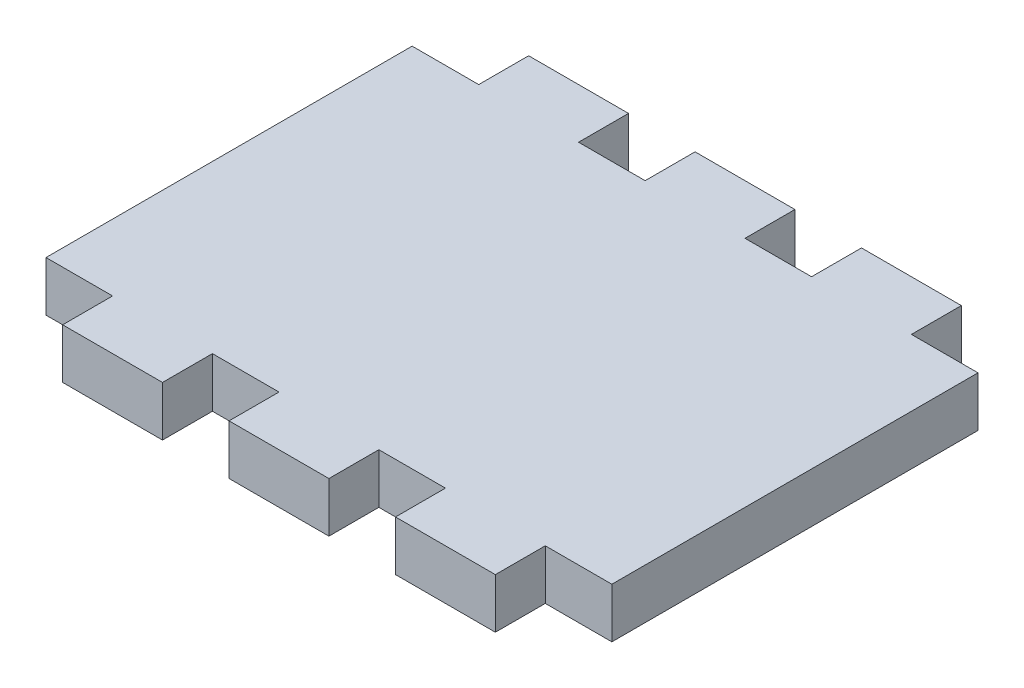
ISO-10303-21;
HEADER;
FILE_DESCRIPTION(('STEP AP214'),'2;1');
FILE_NAME('part.step','',(''),(''),'','','');
FILE_SCHEMA(('AUTOMOTIVE_DESIGN { 1 0 10303 214 1 1 1 1 }'));
ENDSEC;
DATA;
#1=APPLICATION_CONTEXT('core data for automotive mechanical design processes');
#2=APPLICATION_PROTOCOL_DEFINITION('international standard','automotive_design',2000,#1);
#3=PRODUCT_CONTEXT('',#1,'mechanical');
#4=PRODUCT('Part','Part','',(#3));
#5=PRODUCT_RELATED_PRODUCT_CATEGORY('part','',(#4));
#6=PRODUCT_DEFINITION_FORMATION('','',#4);
#7=PRODUCT_DEFINITION_CONTEXT('part definition',#1,'design');
#8=PRODUCT_DEFINITION('design','',#6,#7);
#9=PRODUCT_DEFINITION_SHAPE('','',#8);
#10=(LENGTH_UNIT() NAMED_UNIT(*) SI_UNIT(.MILLI.,.METRE.));
#11=(NAMED_UNIT(*) PLANE_ANGLE_UNIT() SI_UNIT($,.RADIAN.));
#12=(NAMED_UNIT(*) SI_UNIT($,.STERADIAN.) SOLID_ANGLE_UNIT());
#13=UNCERTAINTY_MEASURE_WITH_UNIT(LENGTH_MEASURE(1.E-05),#10,'distance_accuracy_value','');
#14=(GEOMETRIC_REPRESENTATION_CONTEXT(3) GLOBAL_UNCERTAINTY_ASSIGNED_CONTEXT((#13)) GLOBAL_UNIT_ASSIGNED_CONTEXT((#10,
#11,#12)) REPRESENTATION_CONTEXT('',''));
#15=CARTESIAN_POINT('',(0.,0.,0.));
#16=DIRECTION('',(0.,0.,1.));
#17=DIRECTION('',(1.,0.,0.));
#18=AXIS2_PLACEMENT_3D('',#15,#16,#17);
#19=CARTESIAN_POINT('',(-17.,3.,14.));
#20=DIRECTION('',(0.,0.,-1.));
#21=DIRECTION('',(-1.,0.,0.));
#22=AXIS2_PLACEMENT_3D('',#19,#20,#21);
#23=PLANE('',#22);
#24=DIRECTION('',(1.,0.,0.));
#25=VECTOR('',#24,1.);
#26=CARTESIAN_POINT('',(-17.,0.,14.));
#27=LINE('',#26,#25);
#28=CARTESIAN_POINT('',(-3.,0.,14.));
#29=VERTEX_POINT('',#28);
#30=CARTESIAN_POINT('',(3.,0.,14.));
#31=VERTEX_POINT('',#30);
#32=EDGE_CURVE('E243',#29,#31,#27,.T.);
#33=ORIENTED_EDGE('',*,*,#32,.T.);
#34=DIRECTION('',(0.,1.,0.));
#35=VECTOR('',#34,1.);
#36=CARTESIAN_POINT('',(3.,0.,14.));
#37=LINE('',#36,#35);
#38=CARTESIAN_POINT('',(3.,3.,14.));
#39=VERTEX_POINT('',#38);
#40=EDGE_CURVE('E439',#31,#39,#37,.T.);
#41=ORIENTED_EDGE('',*,*,#40,.T.);
#42=DIRECTION('',(1.,0.,0.));
#43=VECTOR('',#42,1.);
#44=CARTESIAN_POINT('',(-17.,3.,14.));
#45=LINE('',#44,#43);
#46=CARTESIAN_POINT('',(-3.,3.,14.));
#47=VERTEX_POINT('',#46);
#48=EDGE_CURVE('E42',#47,#39,#45,.T.);
#49=ORIENTED_EDGE('',*,*,#48,.F.);
#50=DIRECTION('',(0.,1.,0.));
#51=VECTOR('',#50,1.);
#52=CARTESIAN_POINT('',(-3.,0.,14.));
#53=LINE('',#52,#51);
#54=EDGE_CURVE('E372',#29,#47,#53,.T.);
#55=ORIENTED_EDGE('',*,*,#54,.F.);
#56=EDGE_LOOP('',(#33,#41,#49,#55));
#57=FACE_BOUND('',#56,.T.);
#58=ADVANCED_FACE('F33',(#57),#23,.F.);
#59=CARTESIAN_POINT('',(-17.,3.,-14.));
#60=DIRECTION('',(0.,0.,1.));
#61=DIRECTION('',(1.,0.,0.));
#62=AXIS2_PLACEMENT_3D('',#59,#60,#61);
#63=PLANE('',#62);
#64=DIRECTION('',(-1.,0.,0.));
#65=VECTOR('',#64,1.);
#66=CARTESIAN_POINT('',(-17.,3.,-14.));
#67=LINE('',#66,#65);
#68=CARTESIAN_POINT('',(3.,3.,-14.));
#69=VERTEX_POINT('',#68);
#70=CARTESIAN_POINT('',(-3.,3.,-14.));
#71=VERTEX_POINT('',#70);
#72=EDGE_CURVE('E261',#69,#71,#67,.T.);
#73=ORIENTED_EDGE('',*,*,#72,.F.);
#74=DIRECTION('',(0.,1.,0.));
#75=VECTOR('',#74,1.);
#76=CARTESIAN_POINT('',(3.,0.,-14.));
#77=LINE('',#76,#75);
#78=CARTESIAN_POINT('',(3.,0.,-14.));
#79=VERTEX_POINT('',#78);
#80=EDGE_CURVE('E398',#79,#69,#77,.T.);
#81=ORIENTED_EDGE('',*,*,#80,.F.);
#82=DIRECTION('',(-1.,0.,0.));
#83=VECTOR('',#82,1.);
#84=CARTESIAN_POINT('',(-17.,0.,-14.));
#85=LINE('',#84,#83);
#86=CARTESIAN_POINT('',(-3.,0.,-14.));
#87=VERTEX_POINT('',#86);
#88=EDGE_CURVE('E274',#79,#87,#85,.T.);
#89=ORIENTED_EDGE('',*,*,#88,.T.);
#90=DIRECTION('',(0.,1.,0.));
#91=VECTOR('',#90,1.);
#92=CARTESIAN_POINT('',(-3.,0.,-14.));
#93=LINE('',#92,#91);
#94=EDGE_CURVE('E339',#87,#71,#93,.T.);
#95=ORIENTED_EDGE('',*,*,#94,.T.);
#96=EDGE_LOOP('',(#73,#81,#89,#95));
#97=FACE_BOUND('',#96,.T.);
#98=ADVANCED_FACE('F396',(#97),#63,.F.);
#99=CARTESIAN_POINT('',(-13.,0.,14.));
#100=VERTEX_POINT('',#99);
#101=CARTESIAN_POINT('',(-7.,0.,14.));
#102=VERTEX_POINT('',#101);
#103=EDGE_CURVE('E37',#100,#102,#27,.T.);
#104=ORIENTED_EDGE('',*,*,#103,.T.);
#105=DIRECTION('',(0.,1.,0.));
#106=VECTOR('',#105,1.);
#107=CARTESIAN_POINT('',(-7.,0.,14.));
#108=LINE('',#107,#106);
#109=CARTESIAN_POINT('',(-7.,3.,14.));
#110=VERTEX_POINT('',#109);
#111=EDGE_CURVE('E368',#102,#110,#108,.T.);
#112=ORIENTED_EDGE('',*,*,#111,.T.);
#113=CARTESIAN_POINT('',(-13.,3.,14.));
#114=VERTEX_POINT('',#113);
#115=EDGE_CURVE('E11',#114,#110,#45,.T.);
#116=ORIENTED_EDGE('',*,*,#115,.F.);
#117=DIRECTION('',(0.,1.,0.));
#118=VECTOR('',#117,1.);
#119=CARTESIAN_POINT('',(-13.,0.,14.));
#120=LINE('',#119,#118);
#121=EDGE_CURVE('E353',#100,#114,#120,.T.);
#122=ORIENTED_EDGE('',*,*,#121,.F.);
#123=EDGE_LOOP('',(#104,#112,#116,#122));
#124=FACE_BOUND('',#123,.T.);
#125=ADVANCED_FACE('F367',(#124),#23,.F.);
#126=CARTESIAN_POINT('',(-7.,3.,-14.));
#127=VERTEX_POINT('',#126);
#128=CARTESIAN_POINT('',(-13.,3.,-14.));
#129=VERTEX_POINT('',#128);
#130=EDGE_CURVE('E254',#127,#129,#67,.T.);
#131=ORIENTED_EDGE('',*,*,#130,.F.);
#132=DIRECTION('',(0.,1.,0.));
#133=VECTOR('',#132,1.);
#134=CARTESIAN_POINT('',(-7.,0.,-14.));
#135=LINE('',#134,#133);
#136=CARTESIAN_POINT('',(-7.,0.,-14.));
#137=VERTEX_POINT('',#136);
#138=EDGE_CURVE('E287',#137,#127,#135,.T.);
#139=ORIENTED_EDGE('',*,*,#138,.F.);
#140=CARTESIAN_POINT('',(-13.,0.,-14.));
#141=VERTEX_POINT('',#140);
#142=EDGE_CURVE('E272',#137,#141,#85,.T.);
#143=ORIENTED_EDGE('',*,*,#142,.T.);
#144=DIRECTION('',(0.,1.,0.));
#145=VECTOR('',#144,1.);
#146=CARTESIAN_POINT('',(-13.,0.,-14.));
#147=LINE('',#146,#145);
#148=EDGE_CURVE('E273',#141,#129,#147,.T.);
#149=ORIENTED_EDGE('',*,*,#148,.T.);
#150=EDGE_LOOP('',(#131,#139,#143,#149));
#151=FACE_BOUND('',#150,.T.);
#152=ADVANCED_FACE('F286',(#151),#63,.F.);
#153=CARTESIAN_POINT('',(17.,3.,14.));
#154=DIRECTION('',(-1.,0.,0.));
#155=DIRECTION('',(0.,0.,1.));
#156=AXIS2_PLACEMENT_3D('',#153,#154,#155);
#157=PLANE('',#156);
#158=DIRECTION('',(0.,0.,-1.));
#159=VECTOR('',#158,1.);
#160=CARTESIAN_POINT('',(17.,3.,14.));
#161=LINE('',#160,#159);
#162=CARTESIAN_POINT('',(17.,3.,11.));
#163=VERTEX_POINT('',#162);
#164=CARTESIAN_POINT('',(17.,3.,-11.));
#165=VERTEX_POINT('',#164);
#166=EDGE_CURVE('E249',#163,#165,#161,.T.);
#167=ORIENTED_EDGE('',*,*,#166,.F.);
#168=DIRECTION('',(0.,1.,0.));
#169=VECTOR('',#168,1.);
#170=CARTESIAN_POINT('',(17.,0.,11.));
#171=LINE('',#170,#169);
#172=CARTESIAN_POINT('',(17.,0.,11.));
#173=VERTEX_POINT('',#172);
#174=EDGE_CURVE('E229',#173,#163,#171,.T.);
#175=ORIENTED_EDGE('',*,*,#174,.F.);
#176=DIRECTION('',(0.,0.,-1.));
#177=VECTOR('',#176,1.);
#178=CARTESIAN_POINT('',(17.,0.,14.));
#179=LINE('',#178,#177);
#180=CARTESIAN_POINT('',(17.,0.,-11.));
#181=VERTEX_POINT('',#180);
#182=EDGE_CURVE('E59',#173,#181,#179,.T.);
#183=ORIENTED_EDGE('',*,*,#182,.T.);
#184=DIRECTION('',(0.,1.,0.));
#185=VECTOR('',#184,1.);
#186=CARTESIAN_POINT('',(17.,0.,-11.));
#187=LINE('',#186,#185);
#188=EDGE_CURVE('E498',#181,#165,#187,.T.);
#189=ORIENTED_EDGE('',*,*,#188,.T.);
#190=EDGE_LOOP('',(#167,#175,#183,#189));
#191=FACE_BOUND('',#190,.T.);
#192=ADVANCED_FACE('F35',(#191),#157,.F.);
#193=CARTESIAN_POINT('',(13.,3.,-14.));
#194=VERTEX_POINT('',#193);
#195=CARTESIAN_POINT('',(7.,3.,-14.));
#196=VERTEX_POINT('',#195);
#197=EDGE_CURVE('E263',#194,#196,#67,.T.);
#198=ORIENTED_EDGE('',*,*,#197,.F.);
#199=DIRECTION('',(0.,1.,0.));
#200=VECTOR('',#199,1.);
#201=CARTESIAN_POINT('',(13.,0.,-14.));
#202=LINE('',#201,#200);
#203=CARTESIAN_POINT('',(13.,0.,-14.));
#204=VERTEX_POINT('',#203);
#205=EDGE_CURVE('E453',#204,#194,#202,.T.);
#206=ORIENTED_EDGE('',*,*,#205,.F.);
#207=CARTESIAN_POINT('',(7.,0.,-14.));
#208=VERTEX_POINT('',#207);
#209=EDGE_CURVE('E247',#204,#208,#85,.T.);
#210=ORIENTED_EDGE('',*,*,#209,.T.);
#211=DIRECTION('',(0.,1.,0.));
#212=VECTOR('',#211,1.);
#213=CARTESIAN_POINT('',(7.,0.,-14.));
#214=LINE('',#213,#212);
#215=EDGE_CURVE('E402',#208,#196,#214,.T.);
#216=ORIENTED_EDGE('',*,*,#215,.T.);
#217=EDGE_LOOP('',(#198,#206,#210,#216));
#218=FACE_BOUND('',#217,.T.);
#219=ADVANCED_FACE('F482',(#218),#63,.F.);
#220=CARTESIAN_POINT('',(-17.,3.,14.));
#221=DIRECTION('',(1.,0.,0.));
#222=DIRECTION('',(0.,0.,-1.));
#223=AXIS2_PLACEMENT_3D('',#220,#221,#222);
#224=PLANE('',#223);
#225=DIRECTION('',(0.,0.,1.));
#226=VECTOR('',#225,1.);
#227=CARTESIAN_POINT('',(-17.,0.,14.));
#228=LINE('',#227,#226);
#229=CARTESIAN_POINT('',(-17.,0.,-11.));
#230=VERTEX_POINT('',#229);
#231=CARTESIAN_POINT('',(-17.,0.,11.));
#232=VERTEX_POINT('',#231);
#233=EDGE_CURVE('E244',#230,#232,#228,.T.);
#234=ORIENTED_EDGE('',*,*,#233,.T.);
#235=DIRECTION('',(0.,1.,0.));
#236=VECTOR('',#235,1.);
#237=CARTESIAN_POINT('',(-17.,0.,11.));
#238=LINE('',#237,#236);
#239=CARTESIAN_POINT('',(-17.,3.,11.));
#240=VERTEX_POINT('',#239);
#241=EDGE_CURVE('E309',#232,#240,#238,.T.);
#242=ORIENTED_EDGE('',*,*,#241,.T.);
#243=DIRECTION('',(0.,0.,1.));
#244=VECTOR('',#243,1.);
#245=CARTESIAN_POINT('',(-17.,3.,14.));
#246=LINE('',#245,#244);
#247=CARTESIAN_POINT('',(-17.,3.,-11.));
#248=VERTEX_POINT('',#247);
#249=EDGE_CURVE('E268',#248,#240,#246,.T.);
#250=ORIENTED_EDGE('',*,*,#249,.F.);
#251=DIRECTION('',(0.,1.,0.));
#252=VECTOR('',#251,1.);
#253=CARTESIAN_POINT('',(-17.,0.,-11.));
#254=LINE('',#253,#252);
#255=EDGE_CURVE('E265',#230,#248,#254,.T.);
#256=ORIENTED_EDGE('',*,*,#255,.F.);
#257=EDGE_LOOP('',(#234,#242,#250,#256));
#258=FACE_BOUND('',#257,.T.);
#259=ADVANCED_FACE('F530',(#258),#224,.F.);
#260=CARTESIAN_POINT('',(7.,0.,14.));
#261=VERTEX_POINT('',#260);
#262=CARTESIAN_POINT('',(13.,0.,14.));
#263=VERTEX_POINT('',#262);
#264=EDGE_CURVE('E237',#261,#263,#27,.T.);
#265=ORIENTED_EDGE('',*,*,#264,.T.);
#266=DIRECTION('',(0.,1.,0.));
#267=VECTOR('',#266,1.);
#268=CARTESIAN_POINT('',(13.,0.,14.));
#269=LINE('',#268,#267);
#270=CARTESIAN_POINT('',(13.,3.,14.));
#271=VERTEX_POINT('',#270);
#272=EDGE_CURVE('E221',#263,#271,#269,.T.);
#273=ORIENTED_EDGE('',*,*,#272,.T.);
#274=CARTESIAN_POINT('',(7.,3.,14.));
#275=VERTEX_POINT('',#274);
#276=EDGE_CURVE('E44',#275,#271,#45,.T.);
#277=ORIENTED_EDGE('',*,*,#276,.F.);
#278=DIRECTION('',(0.,1.,0.));
#279=VECTOR('',#278,1.);
#280=CARTESIAN_POINT('',(7.,0.,14.));
#281=LINE('',#280,#279);
#282=EDGE_CURVE('E242',#261,#275,#281,.T.);
#283=ORIENTED_EDGE('',*,*,#282,.F.);
#284=EDGE_LOOP('',(#265,#273,#277,#283));
#285=FACE_BOUND('',#284,.T.);
#286=ADVANCED_FACE('F241',(#285),#23,.F.);
#287=CARTESIAN_POINT('',(0.,3.,0.));
#288=DIRECTION('',(0.,-1.,0.));
#289=DIRECTION('',(0.,0.,-1.));
#290=AXIS2_PLACEMENT_3D('',#287,#288,#289);
#291=PLANE('',#290);
#292=ORIENTED_EDGE('',*,*,#276,.T.);
#293=DIRECTION('',(0.,0.,1.));
#294=VECTOR('',#293,1.);
#295=CARTESIAN_POINT('',(13.,3.,11.));
#296=LINE('',#295,#294);
#297=CARTESIAN_POINT('',(13.,3.,11.));
#298=VERTEX_POINT('',#297);
#299=EDGE_CURVE('E224',#298,#271,#296,.T.);
#300=ORIENTED_EDGE('',*,*,#299,.F.);
#301=DIRECTION('',(-1.,0.,0.));
#302=VECTOR('',#301,1.);
#303=CARTESIAN_POINT('',(13.,3.,11.));
#304=LINE('',#303,#302);
#305=EDGE_CURVE('E238',#163,#298,#304,.T.);
#306=ORIENTED_EDGE('',*,*,#305,.F.);
#307=ORIENTED_EDGE('',*,*,#166,.T.);
#308=DIRECTION('',(1.,0.,0.));
#309=VECTOR('',#308,1.);
#310=CARTESIAN_POINT('',(13.,3.,-11.));
#311=LINE('',#310,#309);
#312=CARTESIAN_POINT('',(13.,3.,-11.));
#313=VERTEX_POINT('',#312);
#314=EDGE_CURVE('E486',#313,#165,#311,.T.);
#315=ORIENTED_EDGE('',*,*,#314,.F.);
#316=DIRECTION('',(0.,0.,1.));
#317=VECTOR('',#316,1.);
#318=CARTESIAN_POINT('',(13.,3.,-14.));
#319=LINE('',#318,#317);
#320=EDGE_CURVE('E485',#194,#313,#319,.T.);
#321=ORIENTED_EDGE('',*,*,#320,.F.);
#322=ORIENTED_EDGE('',*,*,#197,.T.);
#323=DIRECTION('',(0.,0.,-1.));
#324=VECTOR('',#323,1.);
#325=CARTESIAN_POINT('',(7.,3.,-14.));
#326=LINE('',#325,#324);
#327=CARTESIAN_POINT('',(7.,3.,-11.));
#328=VERTEX_POINT('',#327);
#329=EDGE_CURVE('E409',#328,#196,#326,.T.);
#330=ORIENTED_EDGE('',*,*,#329,.F.);
#331=DIRECTION('',(1.,0.,0.));
#332=VECTOR('',#331,1.);
#333=CARTESIAN_POINT('',(3.,3.,-11.));
#334=LINE('',#333,#332);
#335=CARTESIAN_POINT('',(3.,3.,-11.));
#336=VERTEX_POINT('',#335);
#337=EDGE_CURVE('E472',#336,#328,#334,.T.);
#338=ORIENTED_EDGE('',*,*,#337,.F.);
#339=DIRECTION('',(0.,0.,1.));
#340=VECTOR('',#339,1.);
#341=CARTESIAN_POINT('',(3.,3.,-14.));
#342=LINE('',#341,#340);
#343=EDGE_CURVE('E459',#69,#336,#342,.T.);
#344=ORIENTED_EDGE('',*,*,#343,.F.);
#345=ORIENTED_EDGE('',*,*,#72,.T.);
#346=DIRECTION('',(0.,0.,-1.));
#347=VECTOR('',#346,1.);
#348=CARTESIAN_POINT('',(-3.,3.,-14.));
#349=LINE('',#348,#347);
#350=CARTESIAN_POINT('',(-3.,3.,-11.));
#351=VERTEX_POINT('',#350);
#352=EDGE_CURVE('E326',#351,#71,#349,.T.);
#353=ORIENTED_EDGE('',*,*,#352,.F.);
#354=DIRECTION('',(1.,0.,0.));
#355=VECTOR('',#354,1.);
#356=CARTESIAN_POINT('',(-7.,3.,-11.));
#357=LINE('',#356,#355);
#358=CARTESIAN_POINT('',(-7.,3.,-11.));
#359=VERTEX_POINT('',#358);
#360=EDGE_CURVE('E322',#359,#351,#357,.T.);
#361=ORIENTED_EDGE('',*,*,#360,.F.);
#362=DIRECTION('',(0.,0.,1.));
#363=VECTOR('',#362,1.);
#364=CARTESIAN_POINT('',(-7.,3.,-14.));
#365=LINE('',#364,#363);
#366=EDGE_CURVE('E319',#127,#359,#365,.T.);
#367=ORIENTED_EDGE('',*,*,#366,.F.);
#368=ORIENTED_EDGE('',*,*,#130,.T.);
#369=DIRECTION('',(0.,0.,-1.));
#370=VECTOR('',#369,1.);
#371=CARTESIAN_POINT('',(-13.,3.,-14.));
#372=LINE('',#371,#370);
#373=CARTESIAN_POINT('',(-13.,3.,-11.));
#374=VERTEX_POINT('',#373);
#375=EDGE_CURVE('E296',#374,#129,#372,.T.);
#376=ORIENTED_EDGE('',*,*,#375,.F.);
#377=DIRECTION('',(1.,0.,0.));
#378=VECTOR('',#377,1.);
#379=CARTESIAN_POINT('',(-17.,3.,-11.));
#380=LINE('',#379,#378);
#381=EDGE_CURVE('E306',#248,#374,#380,.T.);
#382=ORIENTED_EDGE('',*,*,#381,.F.);
#383=ORIENTED_EDGE('',*,*,#249,.T.);
#384=DIRECTION('',(-1.,0.,0.));
#385=VECTOR('',#384,1.);
#386=CARTESIAN_POINT('',(-17.,3.,11.));
#387=LINE('',#386,#385);
#388=CARTESIAN_POINT('',(-13.,3.,11.));
#389=VERTEX_POINT('',#388);
#390=EDGE_CURVE('E350',#389,#240,#387,.T.);
#391=ORIENTED_EDGE('',*,*,#390,.F.);
#392=DIRECTION('',(0.,0.,-1.));
#393=VECTOR('',#392,1.);
#394=CARTESIAN_POINT('',(-13.,3.,11.));
#395=LINE('',#394,#393);
#396=EDGE_CURVE('E338',#114,#389,#395,.T.);
#397=ORIENTED_EDGE('',*,*,#396,.F.);
#398=ORIENTED_EDGE('',*,*,#115,.T.);
#399=DIRECTION('',(0.,0.,1.));
#400=VECTOR('',#399,1.);
#401=CARTESIAN_POINT('',(-7.,3.,11.));
#402=LINE('',#401,#400);
#403=CARTESIAN_POINT('',(-7.,3.,11.));
#404=VERTEX_POINT('',#403);
#405=EDGE_CURVE('E401',#404,#110,#402,.T.);
#406=ORIENTED_EDGE('',*,*,#405,.F.);
#407=DIRECTION('',(-1.,0.,0.));
#408=VECTOR('',#407,1.);
#409=CARTESIAN_POINT('',(-7.,3.,11.));
#410=LINE('',#409,#408);
#411=CARTESIAN_POINT('',(-3.,3.,11.));
#412=VERTEX_POINT('',#411);
#413=EDGE_CURVE('E418',#412,#404,#410,.T.);
#414=ORIENTED_EDGE('',*,*,#413,.F.);
#415=DIRECTION('',(0.,0.,-1.));
#416=VECTOR('',#415,1.);
#417=CARTESIAN_POINT('',(-3.,3.,11.));
#418=LINE('',#417,#416);
#419=EDGE_CURVE('E404',#47,#412,#418,.T.);
#420=ORIENTED_EDGE('',*,*,#419,.F.);
#421=ORIENTED_EDGE('',*,*,#48,.T.);
#422=DIRECTION('',(0.,0.,1.));
#423=VECTOR('',#422,1.);
#424=CARTESIAN_POINT('',(3.,3.,11.));
#425=LINE('',#424,#423);
#426=CARTESIAN_POINT('',(3.,3.,11.));
#427=VERTEX_POINT('',#426);
#428=EDGE_CURVE('E449',#427,#39,#425,.T.);
#429=ORIENTED_EDGE('',*,*,#428,.F.);
#430=DIRECTION('',(-1.,0.,0.));
#431=VECTOR('',#430,1.);
#432=CARTESIAN_POINT('',(3.,3.,11.));
#433=LINE('',#432,#431);
#434=CARTESIAN_POINT('',(7.,3.,11.));
#435=VERTEX_POINT('',#434);
#436=EDGE_CURVE('E446',#435,#427,#433,.T.);
#437=ORIENTED_EDGE('',*,*,#436,.F.);
#438=DIRECTION('',(0.,0.,-1.));
#439=VECTOR('',#438,1.);
#440=CARTESIAN_POINT('',(7.,3.,11.));
#441=LINE('',#440,#439);
#442=EDGE_CURVE('E444',#275,#435,#441,.T.);
#443=ORIENTED_EDGE('',*,*,#442,.F.);
#444=EDGE_LOOP('',(#292,#300,#306,#307,#315,#321,#322,#330,#338,#344,#345,#353,#361,#367,#368,
#376,#382,#383,#391,#397,#398,#406,#414,#420,#421,#429,#437,#443));
#445=FACE_BOUND('',#444,.T.);
#446=ADVANCED_FACE('F315',(#445),#291,.F.);
#447=CARTESIAN_POINT('',(0.,0.,0.));
#448=DIRECTION('',(0.,-1.,0.));
#449=DIRECTION('',(0.,0.,-1.));
#450=AXIS2_PLACEMENT_3D('',#447,#448,#449);
#451=PLANE('',#450);
#452=DIRECTION('',(0.,0.,1.));
#453=VECTOR('',#452,1.);
#454=CARTESIAN_POINT('',(13.,0.,11.));
#455=LINE('',#454,#453);
#456=CARTESIAN_POINT('',(13.,0.,11.));
#457=VERTEX_POINT('',#456);
#458=EDGE_CURVE('E51',#457,#263,#455,.T.);
#459=ORIENTED_EDGE('',*,*,#458,.T.);
#460=ORIENTED_EDGE('',*,*,#264,.F.);
#461=DIRECTION('',(0.,0.,-1.));
#462=VECTOR('',#461,1.);
#463=CARTESIAN_POINT('',(7.,0.,11.));
#464=LINE('',#463,#462);
#465=CARTESIAN_POINT('',(7.,0.,11.));
#466=VERTEX_POINT('',#465);
#467=EDGE_CURVE('E503',#261,#466,#464,.T.);
#468=ORIENTED_EDGE('',*,*,#467,.T.);
#469=DIRECTION('',(-1.,0.,0.));
#470=VECTOR('',#469,1.);
#471=CARTESIAN_POINT('',(3.,0.,11.));
#472=LINE('',#471,#470);
#473=CARTESIAN_POINT('',(3.,0.,11.));
#474=VERTEX_POINT('',#473);
#475=EDGE_CURVE('E464',#466,#474,#472,.T.);
#476=ORIENTED_EDGE('',*,*,#475,.T.);
#477=DIRECTION('',(0.,0.,1.));
#478=VECTOR('',#477,1.);
#479=CARTESIAN_POINT('',(3.,0.,11.));
#480=LINE('',#479,#478);
#481=EDGE_CURVE('E451',#474,#31,#480,.T.);
#482=ORIENTED_EDGE('',*,*,#481,.T.);
#483=ORIENTED_EDGE('',*,*,#32,.F.);
#484=DIRECTION('',(0.,0.,-1.));
#485=VECTOR('',#484,1.);
#486=CARTESIAN_POINT('',(-3.,0.,11.));
#487=LINE('',#486,#485);
#488=CARTESIAN_POINT('',(-3.,0.,11.));
#489=VERTEX_POINT('',#488);
#490=EDGE_CURVE('E377',#29,#489,#487,.T.);
#491=ORIENTED_EDGE('',*,*,#490,.T.);
#492=DIRECTION('',(-1.,0.,0.));
#493=VECTOR('',#492,1.);
#494=CARTESIAN_POINT('',(-7.,0.,11.));
#495=LINE('',#494,#493);
#496=CARTESIAN_POINT('',(-7.,0.,11.));
#497=VERTEX_POINT('',#496);
#498=EDGE_CURVE('E373',#489,#497,#495,.T.);
#499=ORIENTED_EDGE('',*,*,#498,.T.);
#500=DIRECTION('',(0.,0.,1.));
#501=VECTOR('',#500,1.);
#502=CARTESIAN_POINT('',(-7.,0.,11.));
#503=LINE('',#502,#501);
#504=EDGE_CURVE('E416',#497,#102,#503,.T.);
#505=ORIENTED_EDGE('',*,*,#504,.T.);
#506=ORIENTED_EDGE('',*,*,#103,.F.);
#507=DIRECTION('',(0.,0.,-1.));
#508=VECTOR('',#507,1.);
#509=CARTESIAN_POINT('',(-13.,0.,11.));
#510=LINE('',#509,#508);
#511=CARTESIAN_POINT('',(-13.,0.,11.));
#512=VERTEX_POINT('',#511);
#513=EDGE_CURVE('E346',#100,#512,#510,.T.);
#514=ORIENTED_EDGE('',*,*,#513,.T.);
#515=DIRECTION('',(-1.,0.,0.));
#516=VECTOR('',#515,1.);
#517=CARTESIAN_POINT('',(-17.,0.,11.));
#518=LINE('',#517,#516);
#519=EDGE_CURVE('E349',#512,#232,#518,.T.);
#520=ORIENTED_EDGE('',*,*,#519,.T.);
#521=ORIENTED_EDGE('',*,*,#233,.F.);
#522=DIRECTION('',(1.,0.,0.));
#523=VECTOR('',#522,1.);
#524=CARTESIAN_POINT('',(-17.,0.,-11.));
#525=LINE('',#524,#523);
#526=CARTESIAN_POINT('',(-13.,0.,-11.));
#527=VERTEX_POINT('',#526);
#528=EDGE_CURVE('E301',#230,#527,#525,.T.);
#529=ORIENTED_EDGE('',*,*,#528,.T.);
#530=DIRECTION('',(0.,0.,-1.));
#531=VECTOR('',#530,1.);
#532=CARTESIAN_POINT('',(-13.,0.,-14.));
#533=LINE('',#532,#531);
#534=EDGE_CURVE('E293',#527,#141,#533,.T.);
#535=ORIENTED_EDGE('',*,*,#534,.T.);
#536=ORIENTED_EDGE('',*,*,#142,.F.);
#537=DIRECTION('',(0.,0.,1.));
#538=VECTOR('',#537,1.);
#539=CARTESIAN_POINT('',(-7.,0.,-14.));
#540=LINE('',#539,#538);
#541=CARTESIAN_POINT('',(-7.,0.,-11.));
#542=VERTEX_POINT('',#541);
#543=EDGE_CURVE('E336',#137,#542,#540,.T.);
#544=ORIENTED_EDGE('',*,*,#543,.T.);
#545=DIRECTION('',(1.,0.,0.));
#546=VECTOR('',#545,1.);
#547=CARTESIAN_POINT('',(-7.,0.,-11.));
#548=LINE('',#547,#546);
#549=CARTESIAN_POINT('',(-3.,0.,-11.));
#550=VERTEX_POINT('',#549);
#551=EDGE_CURVE('E381',#542,#550,#548,.T.);
#552=ORIENTED_EDGE('',*,*,#551,.T.);
#553=DIRECTION('',(0.,0.,-1.));
#554=VECTOR('',#553,1.);
#555=CARTESIAN_POINT('',(-3.,0.,-14.));
#556=LINE('',#555,#554);
#557=EDGE_CURVE('E331',#550,#87,#556,.T.);
#558=ORIENTED_EDGE('',*,*,#557,.T.);
#559=ORIENTED_EDGE('',*,*,#88,.F.);
#560=DIRECTION('',(0.,0.,1.));
#561=VECTOR('',#560,1.);
#562=CARTESIAN_POINT('',(3.,0.,-14.));
#563=LINE('',#562,#561);
#564=CARTESIAN_POINT('',(3.,0.,-11.));
#565=VERTEX_POINT('',#564);
#566=EDGE_CURVE('E465',#79,#565,#563,.T.);
#567=ORIENTED_EDGE('',*,*,#566,.T.);
#568=DIRECTION('',(1.,0.,0.));
#569=VECTOR('',#568,1.);
#570=CARTESIAN_POINT('',(3.,0.,-11.));
#571=LINE('',#570,#569);
#572=CARTESIAN_POINT('',(7.,0.,-11.));
#573=VERTEX_POINT('',#572);
#574=EDGE_CURVE('E467',#565,#573,#571,.T.);
#575=ORIENTED_EDGE('',*,*,#574,.T.);
#576=DIRECTION('',(0.,0.,-1.));
#577=VECTOR('',#576,1.);
#578=CARTESIAN_POINT('',(7.,0.,-14.));
#579=LINE('',#578,#577);
#580=EDGE_CURVE('E415',#573,#208,#579,.T.);
#581=ORIENTED_EDGE('',*,*,#580,.T.);
#582=ORIENTED_EDGE('',*,*,#209,.F.);
#583=DIRECTION('',(0.,0.,1.));
#584=VECTOR('',#583,1.);
#585=CARTESIAN_POINT('',(13.,0.,-14.));
#586=LINE('',#585,#584);
#587=CARTESIAN_POINT('',(13.,0.,-11.));
#588=VERTEX_POINT('',#587);
#589=EDGE_CURVE('E490',#204,#588,#586,.T.);
#590=ORIENTED_EDGE('',*,*,#589,.T.);
#591=DIRECTION('',(1.,0.,0.));
#592=VECTOR('',#591,1.);
#593=CARTESIAN_POINT('',(13.,0.,-11.));
#594=LINE('',#593,#592);
#595=EDGE_CURVE('E494',#588,#181,#594,.T.);
#596=ORIENTED_EDGE('',*,*,#595,.T.);
#597=ORIENTED_EDGE('',*,*,#182,.F.);
#598=DIRECTION('',(-1.,0.,0.));
#599=VECTOR('',#598,1.);
#600=CARTESIAN_POINT('',(13.,0.,11.));
#601=LINE('',#600,#599);
#602=EDGE_CURVE('E230',#173,#457,#601,.T.);
#603=ORIENTED_EDGE('',*,*,#602,.T.);
#604=EDGE_LOOP('',(#459,#460,#468,#476,#482,#483,#491,#499,#505,#506,#514,#520,#521,#529,#535,
#536,#544,#552,#558,#559,#567,#575,#581,#582,#590,#596,#597,#603));
#605=FACE_BOUND('',#604,.T.);
#606=ADVANCED_FACE('F235',(#605),#451,.T.);
#607=CARTESIAN_POINT('',(-13.,0.,-14.));
#608=DIRECTION('',(1.,0.,0.));
#609=DIRECTION('',(0.,0.,-1.));
#610=AXIS2_PLACEMENT_3D('',#607,#608,#609);
#611=PLANE('',#610);
#612=ORIENTED_EDGE('',*,*,#375,.T.);
#613=ORIENTED_EDGE('',*,*,#148,.F.);
#614=ORIENTED_EDGE('',*,*,#534,.F.);
#615=DIRECTION('',(0.,1.,0.));
#616=VECTOR('',#615,1.);
#617=CARTESIAN_POINT('',(-13.,0.,-11.));
#618=LINE('',#617,#616);
#619=EDGE_CURVE('E297',#527,#374,#618,.T.);
#620=ORIENTED_EDGE('',*,*,#619,.T.);
#621=EDGE_LOOP('',(#612,#613,#614,#620));
#622=FACE_BOUND('',#621,.T.);
#623=ADVANCED_FACE('F292',(#622),#611,.F.);
#624=CARTESIAN_POINT('',(-17.,0.,-11.));
#625=DIRECTION('',(0.,0.,1.));
#626=DIRECTION('',(1.,0.,0.));
#627=AXIS2_PLACEMENT_3D('',#624,#625,#626);
#628=PLANE('',#627);
#629=ORIENTED_EDGE('',*,*,#381,.T.);
#630=ORIENTED_EDGE('',*,*,#619,.F.);
#631=ORIENTED_EDGE('',*,*,#528,.F.);
#632=ORIENTED_EDGE('',*,*,#255,.T.);
#633=EDGE_LOOP('',(#629,#630,#631,#632));
#634=FACE_BOUND('',#633,.T.);
#635=ADVANCED_FACE('F312',(#634),#628,.F.);
#636=CARTESIAN_POINT('',(-17.,0.,11.));
#637=DIRECTION('',(0.,0.,-1.));
#638=DIRECTION('',(-1.,0.,0.));
#639=AXIS2_PLACEMENT_3D('',#636,#637,#638);
#640=PLANE('',#639);
#641=ORIENTED_EDGE('',*,*,#390,.T.);
#642=ORIENTED_EDGE('',*,*,#241,.F.);
#643=ORIENTED_EDGE('',*,*,#519,.F.);
#644=DIRECTION('',(0.,1.,0.));
#645=VECTOR('',#644,1.);
#646=CARTESIAN_POINT('',(-13.,0.,11.));
#647=LINE('',#646,#645);
#648=EDGE_CURVE('E359',#512,#389,#647,.T.);
#649=ORIENTED_EDGE('',*,*,#648,.T.);
#650=EDGE_LOOP('',(#641,#642,#643,#649));
#651=FACE_BOUND('',#650,.T.);
#652=ADVANCED_FACE('F541',(#651),#640,.F.);
#653=CARTESIAN_POINT('',(-13.,0.,11.));
#654=DIRECTION('',(1.,0.,0.));
#655=DIRECTION('',(0.,0.,-1.));
#656=AXIS2_PLACEMENT_3D('',#653,#654,#655);
#657=PLANE('',#656);
#658=ORIENTED_EDGE('',*,*,#396,.T.);
#659=ORIENTED_EDGE('',*,*,#648,.F.);
#660=ORIENTED_EDGE('',*,*,#513,.F.);
#661=ORIENTED_EDGE('',*,*,#121,.T.);
#662=EDGE_LOOP('',(#658,#659,#660,#661));
#663=FACE_BOUND('',#662,.T.);
#664=ADVANCED_FACE('F362',(#663),#657,.F.);
#665=CARTESIAN_POINT('',(-7.,0.,-14.));
#666=DIRECTION('',(-1.,0.,0.));
#667=DIRECTION('',(0.,0.,1.));
#668=AXIS2_PLACEMENT_3D('',#665,#666,#667);
#669=PLANE('',#668);
#670=ORIENTED_EDGE('',*,*,#366,.T.);
#671=DIRECTION('',(0.,1.,0.));
#672=VECTOR('',#671,1.);
#673=CARTESIAN_POINT('',(-7.,0.,-11.));
#674=LINE('',#673,#672);
#675=EDGE_CURVE('E344',#542,#359,#674,.T.);
#676=ORIENTED_EDGE('',*,*,#675,.F.);
#677=ORIENTED_EDGE('',*,*,#543,.F.);
#678=ORIENTED_EDGE('',*,*,#138,.T.);
#679=EDGE_LOOP('',(#670,#676,#677,#678));
#680=FACE_BOUND('',#679,.T.);
#681=ADVANCED_FACE('F548',(#680),#669,.F.);
#682=CARTESIAN_POINT('',(-3.,0.,-14.));
#683=DIRECTION('',(1.,0.,0.));
#684=DIRECTION('',(0.,0.,-1.));
#685=AXIS2_PLACEMENT_3D('',#682,#683,#684);
#686=PLANE('',#685);
#687=ORIENTED_EDGE('',*,*,#352,.T.);
#688=ORIENTED_EDGE('',*,*,#94,.F.);
#689=ORIENTED_EDGE('',*,*,#557,.F.);
#690=DIRECTION('',(0.,1.,0.));
#691=VECTOR('',#690,1.);
#692=CARTESIAN_POINT('',(-3.,0.,-11.));
#693=LINE('',#692,#691);
#694=EDGE_CURVE('E342',#550,#351,#693,.T.);
#695=ORIENTED_EDGE('',*,*,#694,.T.);
#696=EDGE_LOOP('',(#687,#688,#689,#695));
#697=FACE_BOUND('',#696,.T.);
#698=ADVANCED_FACE('F390',(#697),#686,.F.);
#699=CARTESIAN_POINT('',(-7.,0.,-11.));
#700=DIRECTION('',(0.,0.,1.));
#701=DIRECTION('',(1.,0.,0.));
#702=AXIS2_PLACEMENT_3D('',#699,#700,#701);
#703=PLANE('',#702);
#704=ORIENTED_EDGE('',*,*,#360,.T.);
#705=ORIENTED_EDGE('',*,*,#694,.F.);
#706=ORIENTED_EDGE('',*,*,#551,.F.);
#707=ORIENTED_EDGE('',*,*,#675,.T.);
#708=EDGE_LOOP('',(#704,#705,#706,#707));
#709=FACE_BOUND('',#708,.T.);
#710=ADVANCED_FACE('F392',(#709),#703,.F.);
#711=CARTESIAN_POINT('',(-7.,0.,11.));
#712=DIRECTION('',(-1.,0.,0.));
#713=DIRECTION('',(0.,0.,1.));
#714=AXIS2_PLACEMENT_3D('',#711,#712,#713);
#715=PLANE('',#714);
#716=ORIENTED_EDGE('',*,*,#405,.T.);
#717=ORIENTED_EDGE('',*,*,#111,.F.);
#718=ORIENTED_EDGE('',*,*,#504,.F.);
#719=DIRECTION('',(0.,1.,0.));
#720=VECTOR('',#719,1.);
#721=CARTESIAN_POINT('',(-7.,0.,11.));
#722=LINE('',#721,#720);
#723=EDGE_CURVE('E324',#497,#404,#722,.T.);
#724=ORIENTED_EDGE('',*,*,#723,.T.);
#725=EDGE_LOOP('',(#716,#717,#718,#724));
#726=FACE_BOUND('',#725,.T.);
#727=ADVANCED_FACE('F434',(#726),#715,.F.);
#728=CARTESIAN_POINT('',(-7.,0.,11.));
#729=DIRECTION('',(0.,0.,-1.));
#730=DIRECTION('',(-1.,0.,0.));
#731=AXIS2_PLACEMENT_3D('',#728,#729,#730);
#732=PLANE('',#731);
#733=ORIENTED_EDGE('',*,*,#413,.T.);
#734=ORIENTED_EDGE('',*,*,#723,.F.);
#735=ORIENTED_EDGE('',*,*,#498,.F.);
#736=DIRECTION('',(0.,1.,0.));
#737=VECTOR('',#736,1.);
#738=CARTESIAN_POINT('',(-3.,0.,11.));
#739=LINE('',#738,#737);
#740=EDGE_CURVE('E328',#489,#412,#739,.T.);
#741=ORIENTED_EDGE('',*,*,#740,.T.);
#742=EDGE_LOOP('',(#733,#734,#735,#741));
#743=FACE_BOUND('',#742,.T.);
#744=ADVANCED_FACE('F426',(#743),#732,.F.);
#745=CARTESIAN_POINT('',(-3.,0.,11.));
#746=DIRECTION('',(1.,0.,0.));
#747=DIRECTION('',(0.,0.,-1.));
#748=AXIS2_PLACEMENT_3D('',#745,#746,#747);
#749=PLANE('',#748);
#750=ORIENTED_EDGE('',*,*,#419,.T.);
#751=ORIENTED_EDGE('',*,*,#740,.F.);
#752=ORIENTED_EDGE('',*,*,#490,.F.);
#753=ORIENTED_EDGE('',*,*,#54,.T.);
#754=EDGE_LOOP('',(#750,#751,#752,#753));
#755=FACE_BOUND('',#754,.T.);
#756=ADVANCED_FACE('F430',(#755),#749,.F.);
#757=CARTESIAN_POINT('',(3.,0.,-14.));
#758=DIRECTION('',(-1.,0.,0.));
#759=DIRECTION('',(0.,0.,1.));
#760=AXIS2_PLACEMENT_3D('',#757,#758,#759);
#761=PLANE('',#760);
#762=ORIENTED_EDGE('',*,*,#343,.T.);
#763=DIRECTION('',(0.,1.,0.));
#764=VECTOR('',#763,1.);
#765=CARTESIAN_POINT('',(3.,0.,-11.));
#766=LINE('',#765,#764);
#767=EDGE_CURVE('E413',#565,#336,#766,.T.);
#768=ORIENTED_EDGE('',*,*,#767,.F.);
#769=ORIENTED_EDGE('',*,*,#566,.F.);
#770=ORIENTED_EDGE('',*,*,#80,.T.);
#771=EDGE_LOOP('',(#762,#768,#769,#770));
#772=FACE_BOUND('',#771,.T.);
#773=ADVANCED_FACE('F696',(#772),#761,.F.);
#774=CARTESIAN_POINT('',(7.,0.,-14.));
#775=DIRECTION('',(1.,0.,0.));
#776=DIRECTION('',(0.,0.,-1.));
#777=AXIS2_PLACEMENT_3D('',#774,#775,#776);
#778=PLANE('',#777);
#779=ORIENTED_EDGE('',*,*,#329,.T.);
#780=ORIENTED_EDGE('',*,*,#215,.F.);
#781=ORIENTED_EDGE('',*,*,#580,.F.);
#782=DIRECTION('',(0.,1.,0.));
#783=VECTOR('',#782,1.);
#784=CARTESIAN_POINT('',(7.,0.,-11.));
#785=LINE('',#784,#783);
#786=EDGE_CURVE('E406',#573,#328,#785,.T.);
#787=ORIENTED_EDGE('',*,*,#786,.T.);
#788=EDGE_LOOP('',(#779,#780,#781,#787));
#789=FACE_BOUND('',#788,.T.);
#790=ADVANCED_FACE('F480',(#789),#778,.F.);
#791=CARTESIAN_POINT('',(3.,0.,-11.));
#792=DIRECTION('',(0.,0.,1.));
#793=DIRECTION('',(1.,0.,0.));
#794=AXIS2_PLACEMENT_3D('',#791,#792,#793);
#795=PLANE('',#794);
#796=ORIENTED_EDGE('',*,*,#337,.T.);
#797=ORIENTED_EDGE('',*,*,#786,.F.);
#798=ORIENTED_EDGE('',*,*,#574,.F.);
#799=ORIENTED_EDGE('',*,*,#767,.T.);
#800=EDGE_LOOP('',(#796,#797,#798,#799));
#801=FACE_BOUND('',#800,.T.);
#802=ADVANCED_FACE('F681',(#801),#795,.F.);
#803=CARTESIAN_POINT('',(3.,0.,11.));
#804=DIRECTION('',(-1.,0.,0.));
#805=DIRECTION('',(0.,0.,1.));
#806=AXIS2_PLACEMENT_3D('',#803,#804,#805);
#807=PLANE('',#806);
#808=ORIENTED_EDGE('',*,*,#428,.T.);
#809=ORIENTED_EDGE('',*,*,#40,.F.);
#810=ORIENTED_EDGE('',*,*,#481,.F.);
#811=DIRECTION('',(0.,1.,0.));
#812=VECTOR('',#811,1.);
#813=CARTESIAN_POINT('',(3.,0.,11.));
#814=LINE('',#813,#812);
#815=EDGE_CURVE('E457',#474,#427,#814,.T.);
#816=ORIENTED_EDGE('',*,*,#815,.T.);
#817=EDGE_LOOP('',(#808,#809,#810,#816));
#818=FACE_BOUND('',#817,.T.);
#819=ADVANCED_FACE('F518',(#818),#807,.F.);
#820=CARTESIAN_POINT('',(3.,0.,11.));
#821=DIRECTION('',(0.,0.,-1.));
#822=DIRECTION('',(-1.,0.,0.));
#823=AXIS2_PLACEMENT_3D('',#820,#821,#822);
#824=PLANE('',#823);
#825=ORIENTED_EDGE('',*,*,#436,.T.);
#826=ORIENTED_EDGE('',*,*,#815,.F.);
#827=ORIENTED_EDGE('',*,*,#475,.F.);
#828=DIRECTION('',(0.,1.,0.));
#829=VECTOR('',#828,1.);
#830=CARTESIAN_POINT('',(7.,0.,11.));
#831=LINE('',#830,#829);
#832=EDGE_CURVE('E460',#466,#435,#831,.T.);
#833=ORIENTED_EDGE('',*,*,#832,.T.);
#834=EDGE_LOOP('',(#825,#826,#827,#833));
#835=FACE_BOUND('',#834,.T.);
#836=ADVANCED_FACE('F507',(#835),#824,.F.);
#837=CARTESIAN_POINT('',(7.,0.,11.));
#838=DIRECTION('',(1.,0.,0.));
#839=DIRECTION('',(0.,0.,-1.));
#840=AXIS2_PLACEMENT_3D('',#837,#838,#839);
#841=PLANE('',#840);
#842=ORIENTED_EDGE('',*,*,#442,.T.);
#843=ORIENTED_EDGE('',*,*,#832,.F.);
#844=ORIENTED_EDGE('',*,*,#467,.F.);
#845=ORIENTED_EDGE('',*,*,#282,.T.);
#846=EDGE_LOOP('',(#842,#843,#844,#845));
#847=FACE_BOUND('',#846,.T.);
#848=ADVANCED_FACE('F508',(#847),#841,.F.);
#849=CARTESIAN_POINT('',(13.,0.,-14.));
#850=DIRECTION('',(-1.,0.,0.));
#851=DIRECTION('',(0.,0.,1.));
#852=AXIS2_PLACEMENT_3D('',#849,#850,#851);
#853=PLANE('',#852);
#854=ORIENTED_EDGE('',*,*,#320,.T.);
#855=DIRECTION('',(0.,1.,0.));
#856=VECTOR('',#855,1.);
#857=CARTESIAN_POINT('',(13.,0.,-11.));
#858=LINE('',#857,#856);
#859=EDGE_CURVE('E500',#588,#313,#858,.T.);
#860=ORIENTED_EDGE('',*,*,#859,.F.);
#861=ORIENTED_EDGE('',*,*,#589,.F.);
#862=ORIENTED_EDGE('',*,*,#205,.T.);
#863=EDGE_LOOP('',(#854,#860,#861,#862));
#864=FACE_BOUND('',#863,.T.);
#865=ADVANCED_FACE('F510',(#864),#853,.F.);
#866=CARTESIAN_POINT('',(13.,0.,-11.));
#867=DIRECTION('',(0.,0.,1.));
#868=DIRECTION('',(1.,0.,0.));
#869=AXIS2_PLACEMENT_3D('',#866,#867,#868);
#870=PLANE('',#869);
#871=ORIENTED_EDGE('',*,*,#314,.T.);
#872=ORIENTED_EDGE('',*,*,#188,.F.);
#873=ORIENTED_EDGE('',*,*,#595,.F.);
#874=ORIENTED_EDGE('',*,*,#859,.T.);
#875=EDGE_LOOP('',(#871,#872,#873,#874));
#876=FACE_BOUND('',#875,.T.);
#877=ADVANCED_FACE('F516',(#876),#870,.F.);
#878=CARTESIAN_POINT('',(13.,0.,11.));
#879=DIRECTION('',(-1.,0.,0.));
#880=DIRECTION('',(0.,0.,1.));
#881=AXIS2_PLACEMENT_3D('',#878,#879,#880);
#882=PLANE('',#881);
#883=ORIENTED_EDGE('',*,*,#299,.T.);
#884=ORIENTED_EDGE('',*,*,#272,.F.);
#885=ORIENTED_EDGE('',*,*,#458,.F.);
#886=DIRECTION('',(0.,1.,0.));
#887=VECTOR('',#886,1.);
#888=CARTESIAN_POINT('',(13.,0.,11.));
#889=LINE('',#888,#887);
#890=EDGE_CURVE('E488',#457,#298,#889,.T.);
#891=ORIENTED_EDGE('',*,*,#890,.T.);
#892=EDGE_LOOP('',(#883,#884,#885,#891));
#893=FACE_BOUND('',#892,.T.);
#894=ADVANCED_FACE('F222',(#893),#882,.F.);
#895=CARTESIAN_POINT('',(13.,0.,11.));
#896=DIRECTION('',(0.,0.,-1.));
#897=DIRECTION('',(-1.,0.,0.));
#898=AXIS2_PLACEMENT_3D('',#895,#896,#897);
#899=PLANE('',#898);
#900=ORIENTED_EDGE('',*,*,#305,.T.);
#901=ORIENTED_EDGE('',*,*,#890,.F.);
#902=ORIENTED_EDGE('',*,*,#602,.F.);
#903=ORIENTED_EDGE('',*,*,#174,.T.);
#904=EDGE_LOOP('',(#900,#901,#902,#903));
#905=FACE_BOUND('',#904,.T.);
#906=ADVANCED_FACE('F635',(#905),#899,.F.);
#907=CLOSED_SHELL('',(#58,#98,#125,#152,#192,#219,#259,#286,#446,#606,#623,#635,#652,#664,#681,
#698,#710,#727,#744,#756,#773,#790,#802,#819,#836,#848,#865,#877,#894,#906));
#908=MANIFOLD_SOLID_BREP('B2',#907);
#909=ADVANCED_BREP_SHAPE_REPRESENTATION('',(#18,#908),#14);
#910=SHAPE_DEFINITION_REPRESENTATION(#9,#909);
ENDSEC;
END-ISO-10303-21;
